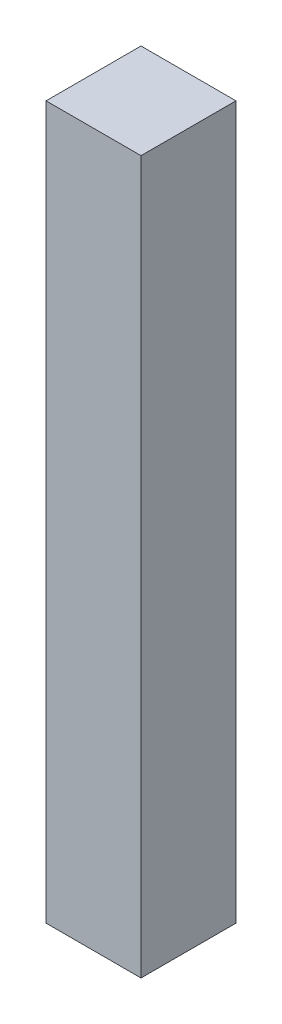
ISO-10303-21;
HEADER;
FILE_DESCRIPTION(('STEP AP214'),'2;1');
FILE_NAME('part.step','',(''),(''),'','','');
FILE_SCHEMA(('AUTOMOTIVE_DESIGN { 1 0 10303 214 1 1 1 1 }'));
ENDSEC;
DATA;
#1=APPLICATION_CONTEXT('core data for automotive mechanical design processes');
#2=APPLICATION_PROTOCOL_DEFINITION('international standard','automotive_design',2000,#1);
#3=PRODUCT_CONTEXT('',#1,'mechanical');
#4=PRODUCT('Part','Part','',(#3));
#5=PRODUCT_RELATED_PRODUCT_CATEGORY('part','',(#4));
#6=PRODUCT_DEFINITION_FORMATION('','',#4);
#7=PRODUCT_DEFINITION_CONTEXT('part definition',#1,'design');
#8=PRODUCT_DEFINITION('design','',#6,#7);
#9=PRODUCT_DEFINITION_SHAPE('','',#8);
#10=(LENGTH_UNIT() NAMED_UNIT(*) SI_UNIT(.MILLI.,.METRE.));
#11=(NAMED_UNIT(*) PLANE_ANGLE_UNIT() SI_UNIT($,.RADIAN.));
#12=(NAMED_UNIT(*) SI_UNIT($,.STERADIAN.) SOLID_ANGLE_UNIT());
#13=UNCERTAINTY_MEASURE_WITH_UNIT(LENGTH_MEASURE(1.E-05),#10,'distance_accuracy_value','');
#14=(GEOMETRIC_REPRESENTATION_CONTEXT(3) GLOBAL_UNCERTAINTY_ASSIGNED_CONTEXT((#13)) GLOBAL_UNIT_ASSIGNED_CONTEXT((#10,
#11,#12)) REPRESENTATION_CONTEXT('',''));
#15=CARTESIAN_POINT('',(0.,0.,0.));
#16=DIRECTION('',(0.,0.,1.));
#17=DIRECTION('',(1.,0.,0.));
#18=AXIS2_PLACEMENT_3D('',#15,#16,#17);
#19=CARTESIAN_POINT('',(10.,75.,10.));
#20=DIRECTION('',(-1.,0.,0.));
#21=DIRECTION('',(0.,0.,1.));
#22=AXIS2_PLACEMENT_3D('',#19,#20,#21);
#23=PLANE('',#22);
#24=DIRECTION('',(0.,0.,-1.));
#25=VECTOR('',#24,1.);
#26=CARTESIAN_POINT('',(10.,-75.,10.));
#27=LINE('',#26,#25);
#28=CARTESIAN_POINT('',(10.,-75.,10.));
#29=VERTEX_POINT('',#28);
#30=CARTESIAN_POINT('',(10.,-75.,-10.));
#31=VERTEX_POINT('',#30);
#32=EDGE_CURVE('E103',#29,#31,#27,.T.);
#33=ORIENTED_EDGE('',*,*,#32,.T.);
#34=DIRECTION('',(0.,-1.,0.));
#35=VECTOR('',#34,1.);
#36=CARTESIAN_POINT('',(10.,75.,-10.));
#37=LINE('',#36,#35);
#38=CARTESIAN_POINT('',(10.,75.,-10.));
#39=VERTEX_POINT('',#38);
#40=EDGE_CURVE('E11',#39,#31,#37,.T.);
#41=ORIENTED_EDGE('',*,*,#40,.F.);
#42=DIRECTION('',(0.,0.,-1.));
#43=VECTOR('',#42,1.);
#44=CARTESIAN_POINT('',(10.,75.,10.));
#45=LINE('',#44,#43);
#46=CARTESIAN_POINT('',(10.,75.,10.));
#47=VERTEX_POINT('',#46);
#48=EDGE_CURVE('E91',#47,#39,#45,.T.);
#49=ORIENTED_EDGE('',*,*,#48,.F.);
#50=DIRECTION('',(0.,-1.,0.));
#51=VECTOR('',#50,1.);
#52=CARTESIAN_POINT('',(10.,75.,10.));
#53=LINE('',#52,#51);
#54=EDGE_CURVE('E99',#47,#29,#53,.T.);
#55=ORIENTED_EDGE('',*,*,#54,.T.);
#56=EDGE_LOOP('',(#33,#41,#49,#55));
#57=FACE_BOUND('',#56,.T.);
#58=ADVANCED_FACE('F40',(#57),#23,.F.);
#59=CARTESIAN_POINT('',(-10.,75.,-10.));
#60=DIRECTION('',(0.,0.,1.));
#61=DIRECTION('',(1.,0.,0.));
#62=AXIS2_PLACEMENT_3D('',#59,#60,#61);
#63=PLANE('',#62);
#64=DIRECTION('',(-1.,0.,0.));
#65=VECTOR('',#64,1.);
#66=CARTESIAN_POINT('',(-10.,-75.,-10.));
#67=LINE('',#66,#65);
#68=CARTESIAN_POINT('',(-10.,-75.,-10.));
#69=VERTEX_POINT('',#68);
#70=EDGE_CURVE('E95',#31,#69,#67,.T.);
#71=ORIENTED_EDGE('',*,*,#70,.T.);
#72=DIRECTION('',(0.,-1.,0.));
#73=VECTOR('',#72,1.);
#74=CARTESIAN_POINT('',(-10.,75.,-10.));
#75=LINE('',#74,#73);
#76=CARTESIAN_POINT('',(-10.,75.,-10.));
#77=VERTEX_POINT('',#76);
#78=EDGE_CURVE('E48',#77,#69,#75,.T.);
#79=ORIENTED_EDGE('',*,*,#78,.F.);
#80=DIRECTION('',(-1.,0.,0.));
#81=VECTOR('',#80,1.);
#82=CARTESIAN_POINT('',(-10.,75.,-10.));
#83=LINE('',#82,#81);
#84=EDGE_CURVE('E86',#39,#77,#83,.T.);
#85=ORIENTED_EDGE('',*,*,#84,.F.);
#86=ORIENTED_EDGE('',*,*,#40,.T.);
#87=EDGE_LOOP('',(#71,#79,#85,#86));
#88=FACE_BOUND('',#87,.T.);
#89=ADVANCED_FACE('F94',(#88),#63,.F.);
#90=CARTESIAN_POINT('',(-10.,75.,10.));
#91=DIRECTION('',(1.,0.,0.));
#92=DIRECTION('',(0.,0.,-1.));
#93=AXIS2_PLACEMENT_3D('',#90,#91,#92);
#94=PLANE('',#93);
#95=DIRECTION('',(0.,0.,1.));
#96=VECTOR('',#95,1.);
#97=CARTESIAN_POINT('',(-10.,-75.,10.));
#98=LINE('',#97,#96);
#99=CARTESIAN_POINT('',(-10.,-75.,10.));
#100=VERTEX_POINT('',#99);
#101=EDGE_CURVE('E73',#69,#100,#98,.T.);
#102=ORIENTED_EDGE('',*,*,#101,.T.);
#103=DIRECTION('',(0.,-1.,0.));
#104=VECTOR('',#103,1.);
#105=CARTESIAN_POINT('',(-10.,75.,10.));
#106=LINE('',#105,#104);
#107=CARTESIAN_POINT('',(-10.,75.,10.));
#108=VERTEX_POINT('',#107);
#109=EDGE_CURVE('E96',#108,#100,#106,.T.);
#110=ORIENTED_EDGE('',*,*,#109,.F.);
#111=DIRECTION('',(0.,0.,1.));
#112=VECTOR('',#111,1.);
#113=CARTESIAN_POINT('',(-10.,75.,10.));
#114=LINE('',#113,#112);
#115=EDGE_CURVE('E89',#77,#108,#114,.T.);
#116=ORIENTED_EDGE('',*,*,#115,.F.);
#117=ORIENTED_EDGE('',*,*,#78,.T.);
#118=EDGE_LOOP('',(#102,#110,#116,#117));
#119=FACE_BOUND('',#118,.T.);
#120=ADVANCED_FACE('F97',(#119),#94,.F.);
#121=CARTESIAN_POINT('',(-10.,75.,10.));
#122=DIRECTION('',(0.,0.,-1.));
#123=DIRECTION('',(-1.,0.,0.));
#124=AXIS2_PLACEMENT_3D('',#121,#122,#123);
#125=PLANE('',#124);
#126=DIRECTION('',(1.,0.,0.));
#127=VECTOR('',#126,1.);
#128=CARTESIAN_POINT('',(-10.,-75.,10.));
#129=LINE('',#128,#127);
#130=EDGE_CURVE('E79',#100,#29,#129,.T.);
#131=ORIENTED_EDGE('',*,*,#130,.T.);
#132=ORIENTED_EDGE('',*,*,#54,.F.);
#133=DIRECTION('',(1.,0.,0.));
#134=VECTOR('',#133,1.);
#135=CARTESIAN_POINT('',(-10.,75.,10.));
#136=LINE('',#135,#134);
#137=EDGE_CURVE('E56',#108,#47,#136,.T.);
#138=ORIENTED_EDGE('',*,*,#137,.F.);
#139=ORIENTED_EDGE('',*,*,#109,.T.);
#140=EDGE_LOOP('',(#131,#132,#138,#139));
#141=FACE_BOUND('',#140,.T.);
#142=ADVANCED_FACE('F110',(#141),#125,.F.);
#143=CARTESIAN_POINT('',(0.,75.,0.));
#144=DIRECTION('',(0.,-1.,0.));
#145=DIRECTION('',(0.,0.,-1.));
#146=AXIS2_PLACEMENT_3D('',#143,#144,#145);
#147=PLANE('',#146);
#148=ORIENTED_EDGE('',*,*,#48,.T.);
#149=ORIENTED_EDGE('',*,*,#84,.T.);
#150=ORIENTED_EDGE('',*,*,#115,.T.);
#151=ORIENTED_EDGE('',*,*,#137,.T.);
#152=EDGE_LOOP('',(#148,#149,#150,#151));
#153=FACE_BOUND('',#152,.T.);
#154=ADVANCED_FACE('F87',(#153),#147,.F.);
#155=CARTESIAN_POINT('',(0.,-75.,0.));
#156=DIRECTION('',(0.,-1.,0.));
#157=DIRECTION('',(0.,0.,-1.));
#158=AXIS2_PLACEMENT_3D('',#155,#156,#157);
#159=PLANE('',#158);
#160=ORIENTED_EDGE('',*,*,#32,.F.);
#161=ORIENTED_EDGE('',*,*,#130,.F.);
#162=ORIENTED_EDGE('',*,*,#101,.F.);
#163=ORIENTED_EDGE('',*,*,#70,.F.);
#164=EDGE_LOOP('',(#160,#161,#162,#163));
#165=FACE_BOUND('',#164,.T.);
#166=ADVANCED_FACE('F113',(#165),#159,.T.);
#167=CLOSED_SHELL('',(#58,#89,#120,#142,#154,#166));
#168=MANIFOLD_SOLID_BREP('B2',#167);
#169=ADVANCED_BREP_SHAPE_REPRESENTATION('',(#18,#168),#14);
#170=SHAPE_DEFINITION_REPRESENTATION(#9,#169);
ENDSEC;
END-ISO-10303-21;
